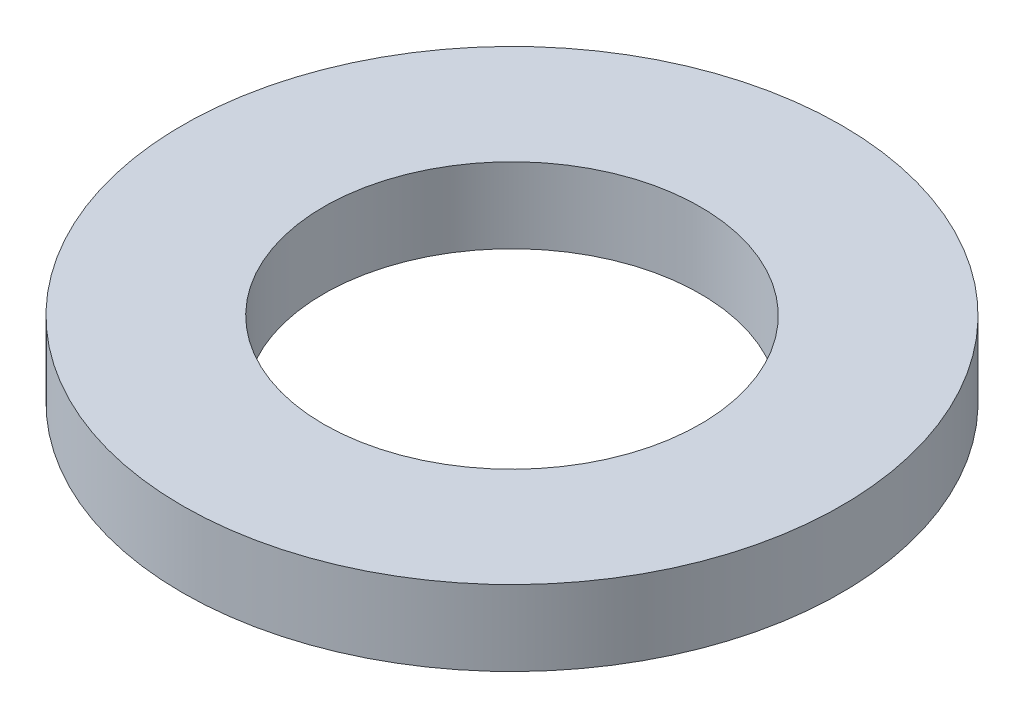
ISO-10303-21;
HEADER;
FILE_DESCRIPTION(('STEP AP214'),'2;1');
FILE_NAME('part.step','',(''),(''),'','','');
FILE_SCHEMA(('AUTOMOTIVE_DESIGN { 1 0 10303 214 1 1 1 1 }'));
ENDSEC;
DATA;
#1=APPLICATION_CONTEXT('core data for automotive mechanical design processes');
#2=APPLICATION_PROTOCOL_DEFINITION('international standard','automotive_design',2000,#1);
#3=PRODUCT_CONTEXT('',#1,'mechanical');
#4=PRODUCT('Part','Part','',(#3));
#5=PRODUCT_RELATED_PRODUCT_CATEGORY('part','',(#4));
#6=PRODUCT_DEFINITION_FORMATION('','',#4);
#7=PRODUCT_DEFINITION_CONTEXT('part definition',#1,'design');
#8=PRODUCT_DEFINITION('design','',#6,#7);
#9=PRODUCT_DEFINITION_SHAPE('','',#8);
#10=(LENGTH_UNIT() NAMED_UNIT(*) SI_UNIT(.MILLI.,.METRE.));
#11=(NAMED_UNIT(*) PLANE_ANGLE_UNIT() SI_UNIT($,.RADIAN.));
#12=(NAMED_UNIT(*) SI_UNIT($,.STERADIAN.) SOLID_ANGLE_UNIT());
#13=UNCERTAINTY_MEASURE_WITH_UNIT(LENGTH_MEASURE(1.E-05),#10,'distance_accuracy_value','');
#14=(GEOMETRIC_REPRESENTATION_CONTEXT(3) GLOBAL_UNCERTAINTY_ASSIGNED_CONTEXT((#13)) GLOBAL_UNIT_ASSIGNED_CONTEXT((#10,
#11,#12)) REPRESENTATION_CONTEXT('',''));
#15=CARTESIAN_POINT('',(0.,0.,0.));
#16=DIRECTION('',(0.,0.,1.));
#17=DIRECTION('',(1.,0.,0.));
#18=AXIS2_PLACEMENT_3D('',#15,#16,#17);
#19=CARTESIAN_POINT('',(0.,4.,0.));
#20=DIRECTION('',(0.,1.,0.));
#21=DIRECTION('',(0.,0.,1.));
#22=AXIS2_PLACEMENT_3D('',#19,#20,#21);
#23=PLANE('',#22);
#24=CARTESIAN_POINT('',(0.,4.,0.));
#25=DIRECTION('',(0.,1.,0.));
#26=DIRECTION('',(0.,0.,1.));
#27=AXIS2_PLACEMENT_3D('',#24,#25,#26);
#28=CIRCLE('',#27,17.5);
#29=CARTESIAN_POINT('',(0.,4.,17.5));
#30=VERTEX_POINT('',#29);
#31=EDGE_CURVE('E10',#30,#30,#28,.T.);
#32=ORIENTED_EDGE('',*,*,#31,.T.);
#33=EDGE_LOOP('',(#32));
#34=FACE_BOUND('',#33,.T.);
#35=CARTESIAN_POINT('',(0.,4.,0.));
#36=DIRECTION('',(0.,1.,0.));
#37=DIRECTION('',(0.,0.,1.));
#38=AXIS2_PLACEMENT_3D('',#35,#36,#37);
#39=CIRCLE('',#38,10.);
#40=CARTESIAN_POINT('',(0.,4.,10.));
#41=VERTEX_POINT('',#40);
#42=EDGE_CURVE('E46',#41,#41,#39,.T.);
#43=ORIENTED_EDGE('',*,*,#42,.F.);
#44=EDGE_LOOP('',(#43));
#45=FACE_BOUND('',#44,.T.);
#46=ADVANCED_FACE('F35',(#34,#45),#23,.T.);
#47=CARTESIAN_POINT('',(0.,0.,0.));
#48=DIRECTION('',(0.,1.,0.));
#49=DIRECTION('',(0.,0.,1.));
#50=AXIS2_PLACEMENT_3D('',#47,#48,#49);
#51=PLANE('',#50);
#52=CARTESIAN_POINT('',(0.,0.,0.));
#53=DIRECTION('',(0.,1.,0.));
#54=DIRECTION('',(0.,0.,1.));
#55=AXIS2_PLACEMENT_3D('',#52,#53,#54);
#56=CIRCLE('',#55,17.5);
#57=CARTESIAN_POINT('',(0.,0.,17.5));
#58=VERTEX_POINT('',#57);
#59=EDGE_CURVE('E39',#58,#58,#56,.T.);
#60=ORIENTED_EDGE('',*,*,#59,.F.);
#61=EDGE_LOOP('',(#60));
#62=FACE_BOUND('',#61,.T.);
#63=CARTESIAN_POINT('',(0.,0.,0.));
#64=DIRECTION('',(0.,1.,0.));
#65=DIRECTION('',(0.,0.,1.));
#66=AXIS2_PLACEMENT_3D('',#63,#64,#65);
#67=CIRCLE('',#66,10.);
#68=CARTESIAN_POINT('',(0.,0.,10.));
#69=VERTEX_POINT('',#68);
#70=EDGE_CURVE('E48',#69,#69,#67,.T.);
#71=ORIENTED_EDGE('',*,*,#70,.T.);
#72=EDGE_LOOP('',(#71));
#73=FACE_BOUND('',#72,.T.);
#74=ADVANCED_FACE('F58',(#62,#73),#51,.F.);
#75=CARTESIAN_POINT('',(0.,4.,0.));
#76=DIRECTION('',(0.,-1.,0.));
#77=DIRECTION('',(0.,0.,-1.));
#78=AXIS2_PLACEMENT_3D('',#75,#76,#77);
#79=CYLINDRICAL_SURFACE('',#78,17.5);
#80=ORIENTED_EDGE('',*,*,#31,.F.);
#81=EDGE_LOOP('',(#80));
#82=FACE_BOUND('',#81,.T.);
#83=ORIENTED_EDGE('',*,*,#59,.T.);
#84=EDGE_LOOP('',(#83));
#85=FACE_BOUND('',#84,.T.);
#86=ADVANCED_FACE('F37',(#82,#85),#79,.T.);
#87=CARTESIAN_POINT('',(0.,4.,0.));
#88=DIRECTION('',(0.,-1.,0.));
#89=DIRECTION('',(0.,0.,-1.));
#90=AXIS2_PLACEMENT_3D('',#87,#88,#89);
#91=CYLINDRICAL_SURFACE('',#90,10.);
#92=ORIENTED_EDGE('',*,*,#42,.T.);
#93=EDGE_LOOP('',(#92));
#94=FACE_BOUND('',#93,.T.);
#95=ORIENTED_EDGE('',*,*,#70,.F.);
#96=EDGE_LOOP('',(#95));
#97=FACE_BOUND('',#96,.T.);
#98=ADVANCED_FACE('F54',(#94,#97),#91,.F.);
#99=CLOSED_SHELL('',(#46,#74,#86,#98));
#100=MANIFOLD_SOLID_BREP('B2',#99);
#101=ADVANCED_BREP_SHAPE_REPRESENTATION('',(#18,#100),#14);
#102=SHAPE_DEFINITION_REPRESENTATION(#9,#101);
ENDSEC;
END-ISO-10303-21;
